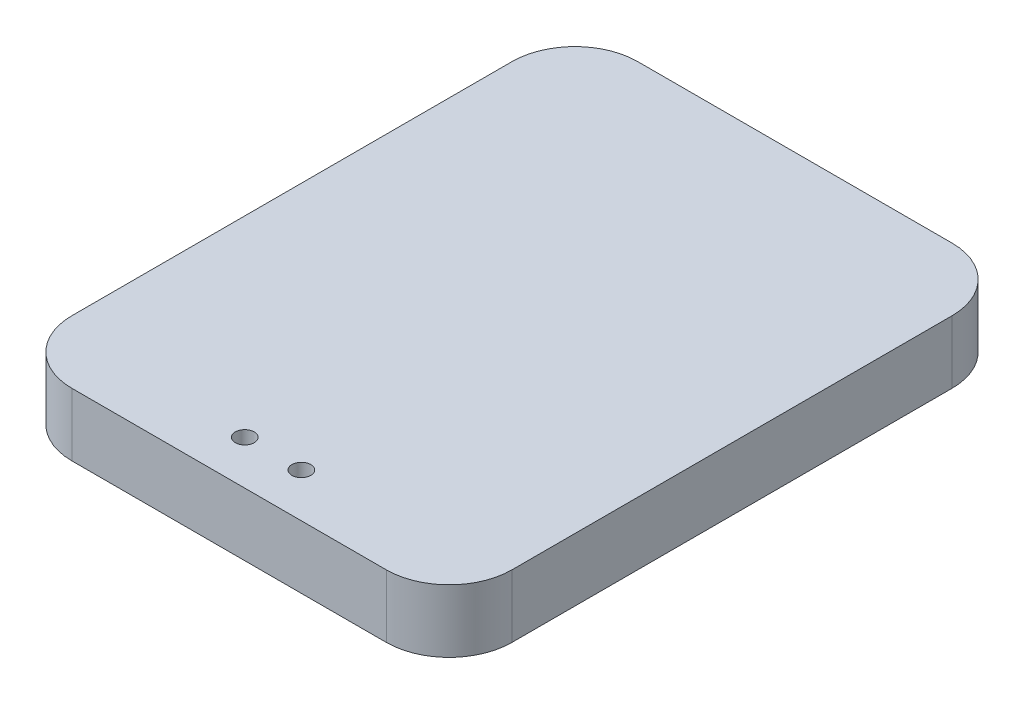
ISO-10303-21;
HEADER;
FILE_DESCRIPTION(('STEP AP214'),'2;1');
FILE_NAME('part.step','',(''),(''),'','','');
FILE_SCHEMA(('AUTOMOTIVE_DESIGN { 1 0 10303 214 1 1 1 1 }'));
ENDSEC;
DATA;
#1=APPLICATION_CONTEXT('core data for automotive mechanical design processes');
#2=APPLICATION_PROTOCOL_DEFINITION('international standard','automotive_design',2000,#1);
#3=PRODUCT_CONTEXT('',#1,'mechanical');
#4=PRODUCT('Part','Part','',(#3));
#5=PRODUCT_RELATED_PRODUCT_CATEGORY('part','',(#4));
#6=PRODUCT_DEFINITION_FORMATION('','',#4);
#7=PRODUCT_DEFINITION_CONTEXT('part definition',#1,'design');
#8=PRODUCT_DEFINITION('design','',#6,#7);
#9=PRODUCT_DEFINITION_SHAPE('','',#8);
#10=(LENGTH_UNIT() NAMED_UNIT(*) SI_UNIT(.MILLI.,.METRE.));
#11=(NAMED_UNIT(*) PLANE_ANGLE_UNIT() SI_UNIT($,.RADIAN.));
#12=(NAMED_UNIT(*) SI_UNIT($,.STERADIAN.) SOLID_ANGLE_UNIT());
#13=UNCERTAINTY_MEASURE_WITH_UNIT(LENGTH_MEASURE(1.E-05),#10,'distance_accuracy_value','');
#14=(GEOMETRIC_REPRESENTATION_CONTEXT(3) GLOBAL_UNCERTAINTY_ASSIGNED_CONTEXT((#13)) GLOBAL_UNIT_ASSIGNED_CONTEXT((#10,
#11,#12)) REPRESENTATION_CONTEXT('',''));
#15=CARTESIAN_POINT('',(0.,0.,0.));
#16=DIRECTION('',(0.,0.,1.));
#17=DIRECTION('',(1.,0.,0.));
#18=AXIS2_PLACEMENT_3D('',#15,#16,#17);
#19=CARTESIAN_POINT('',(-35.,5.,45.));
#20=DIRECTION('',(1.,0.,0.));
#21=DIRECTION('',(0.,0.,-1.));
#22=AXIS2_PLACEMENT_3D('',#19,#20,#21);
#23=PLANE('',#22);
#24=DIRECTION('',(0.,0.,1.));
#25=VECTOR('',#24,1.);
#26=CARTESIAN_POINT('',(-35.,5.,45.));
#27=LINE('',#26,#25);
#28=CARTESIAN_POINT('',(-35.,5.,-35.));
#29=VERTEX_POINT('',#28);
#30=CARTESIAN_POINT('',(-35.,5.,35.));
#31=VERTEX_POINT('',#30);
#32=EDGE_CURVE('E126',#29,#31,#27,.T.);
#33=ORIENTED_EDGE('',*,*,#32,.F.);
#34=DIRECTION('',(0.,-1.,0.));
#35=VECTOR('',#34,1.);
#36=CARTESIAN_POINT('',(-35.,5.,-35.));
#37=LINE('',#36,#35);
#38=CARTESIAN_POINT('',(-35.,-5.,-35.));
#39=VERTEX_POINT('',#38);
#40=EDGE_CURVE('E111',#29,#39,#37,.T.);
#41=ORIENTED_EDGE('',*,*,#40,.T.);
#42=DIRECTION('',(0.,0.,1.));
#43=VECTOR('',#42,1.);
#44=CARTESIAN_POINT('',(-35.,-5.,45.));
#45=LINE('',#44,#43);
#46=CARTESIAN_POINT('',(-35.,-5.,35.));
#47=VERTEX_POINT('',#46);
#48=EDGE_CURVE('E123',#39,#47,#45,.T.);
#49=ORIENTED_EDGE('',*,*,#48,.T.);
#50=DIRECTION('',(0.,-1.,0.));
#51=VECTOR('',#50,1.);
#52=CARTESIAN_POINT('',(-35.,5.,35.));
#53=LINE('',#52,#51);
#54=EDGE_CURVE('E128',#47,#31,#53,.F.);
#55=ORIENTED_EDGE('',*,*,#54,.T.);
#56=EDGE_LOOP('',(#33,#41,#49,#55));
#57=FACE_BOUND('',#56,.T.);
#58=ADVANCED_FACE('F41',(#57),#23,.F.);
#59=CARTESIAN_POINT('',(35.,5.,45.));
#60=DIRECTION('',(0.,0.,-1.));
#61=DIRECTION('',(-1.,0.,0.));
#62=AXIS2_PLACEMENT_3D('',#59,#60,#61);
#63=PLANE('',#62);
#64=DIRECTION('',(1.,0.,0.));
#65=VECTOR('',#64,1.);
#66=CARTESIAN_POINT('',(35.,-5.,45.));
#67=LINE('',#66,#65);
#68=CARTESIAN_POINT('',(-25.,-5.,45.));
#69=VERTEX_POINT('',#68);
#70=CARTESIAN_POINT('',(25.,-5.,45.));
#71=VERTEX_POINT('',#70);
#72=EDGE_CURVE('E132',#69,#71,#67,.T.);
#73=ORIENTED_EDGE('',*,*,#72,.T.);
#74=DIRECTION('',(0.,-1.,0.));
#75=VECTOR('',#74,1.);
#76=CARTESIAN_POINT('',(25.,5.,45.));
#77=LINE('',#76,#75);
#78=CARTESIAN_POINT('',(25.,5.,45.));
#79=VERTEX_POINT('',#78);
#80=EDGE_CURVE('E11',#71,#79,#77,.F.);
#81=ORIENTED_EDGE('',*,*,#80,.T.);
#82=DIRECTION('',(1.,0.,0.));
#83=VECTOR('',#82,1.);
#84=CARTESIAN_POINT('',(35.,5.,45.));
#85=LINE('',#84,#83);
#86=CARTESIAN_POINT('',(-25.,5.,45.));
#87=VERTEX_POINT('',#86);
#88=EDGE_CURVE('E172',#87,#79,#85,.T.);
#89=ORIENTED_EDGE('',*,*,#88,.F.);
#90=DIRECTION('',(0.,-1.,0.));
#91=VECTOR('',#90,1.);
#92=CARTESIAN_POINT('',(-25.,5.,45.));
#93=LINE('',#92,#91);
#94=EDGE_CURVE('E49',#87,#69,#93,.T.);
#95=ORIENTED_EDGE('',*,*,#94,.T.);
#96=EDGE_LOOP('',(#73,#81,#89,#95));
#97=FACE_BOUND('',#96,.T.);
#98=ADVANCED_FACE('F170',(#97),#63,.F.);
#99=CARTESIAN_POINT('',(35.,5.,45.));
#100=DIRECTION('',(-1.,0.,0.));
#101=DIRECTION('',(0.,0.,1.));
#102=AXIS2_PLACEMENT_3D('',#99,#100,#101);
#103=PLANE('',#102);
#104=DIRECTION('',(0.,0.,-1.));
#105=VECTOR('',#104,1.);
#106=CARTESIAN_POINT('',(35.,-5.,45.));
#107=LINE('',#106,#105);
#108=CARTESIAN_POINT('',(35.,-5.,35.));
#109=VERTEX_POINT('',#108);
#110=CARTESIAN_POINT('',(35.,-5.,-35.));
#111=VERTEX_POINT('',#110);
#112=EDGE_CURVE('E136',#109,#111,#107,.T.);
#113=ORIENTED_EDGE('',*,*,#112,.T.);
#114=DIRECTION('',(0.,-1.,0.));
#115=VECTOR('',#114,1.);
#116=CARTESIAN_POINT('',(35.,5.,-35.));
#117=LINE('',#116,#115);
#118=CARTESIAN_POINT('',(35.,5.,-35.));
#119=VERTEX_POINT('',#118);
#120=EDGE_CURVE('E56',#111,#119,#117,.F.);
#121=ORIENTED_EDGE('',*,*,#120,.T.);
#122=DIRECTION('',(0.,0.,-1.));
#123=VECTOR('',#122,1.);
#124=CARTESIAN_POINT('',(35.,5.,45.));
#125=LINE('',#124,#123);
#126=CARTESIAN_POINT('',(35.,5.,35.));
#127=VERTEX_POINT('',#126);
#128=EDGE_CURVE('E180',#127,#119,#125,.T.);
#129=ORIENTED_EDGE('',*,*,#128,.F.);
#130=DIRECTION('',(0.,-1.,0.));
#131=VECTOR('',#130,1.);
#132=CARTESIAN_POINT('',(35.,5.,35.));
#133=LINE('',#132,#131);
#134=EDGE_CURVE('E163',#127,#109,#133,.T.);
#135=ORIENTED_EDGE('',*,*,#134,.T.);
#136=EDGE_LOOP('',(#113,#121,#129,#135));
#137=FACE_BOUND('',#136,.T.);
#138=ADVANCED_FACE('F179',(#137),#103,.F.);
#139=CARTESIAN_POINT('',(35.,5.,-45.));
#140=DIRECTION('',(0.,0.,1.));
#141=DIRECTION('',(1.,0.,0.));
#142=AXIS2_PLACEMENT_3D('',#139,#140,#141);
#143=PLANE('',#142);
#144=DIRECTION('',(-1.,0.,0.));
#145=VECTOR('',#144,1.);
#146=CARTESIAN_POINT('',(35.,-5.,-45.));
#147=LINE('',#146,#145);
#148=CARTESIAN_POINT('',(25.,-5.,-45.));
#149=VERTEX_POINT('',#148);
#150=CARTESIAN_POINT('',(-25.,-5.,-45.));
#151=VERTEX_POINT('',#150);
#152=EDGE_CURVE('E146',#149,#151,#147,.T.);
#153=ORIENTED_EDGE('',*,*,#152,.T.);
#154=DIRECTION('',(0.,-1.,0.));
#155=VECTOR('',#154,1.);
#156=CARTESIAN_POINT('',(-25.,5.,-45.));
#157=LINE('',#156,#155);
#158=CARTESIAN_POINT('',(-25.,5.,-45.));
#159=VERTEX_POINT('',#158);
#160=EDGE_CURVE('E112',#151,#159,#157,.F.);
#161=ORIENTED_EDGE('',*,*,#160,.T.);
#162=DIRECTION('',(-1.,0.,0.));
#163=VECTOR('',#162,1.);
#164=CARTESIAN_POINT('',(35.,5.,-45.));
#165=LINE('',#164,#163);
#166=CARTESIAN_POINT('',(25.,5.,-45.));
#167=VERTEX_POINT('',#166);
#168=EDGE_CURVE('E142',#167,#159,#165,.T.);
#169=ORIENTED_EDGE('',*,*,#168,.F.);
#170=DIRECTION('',(0.,-1.,0.));
#171=VECTOR('',#170,1.);
#172=CARTESIAN_POINT('',(25.,5.,-45.));
#173=LINE('',#172,#171);
#174=EDGE_CURVE('E117',#167,#149,#173,.T.);
#175=ORIENTED_EDGE('',*,*,#174,.T.);
#176=EDGE_LOOP('',(#153,#161,#169,#175));
#177=FACE_BOUND('',#176,.T.);
#178=ADVANCED_FACE('F200',(#177),#143,.F.);
#179=CARTESIAN_POINT('',(0.,5.,0.));
#180=DIRECTION('',(0.,1.,0.));
#181=DIRECTION('',(0.,0.,1.));
#182=AXIS2_PLACEMENT_3D('',#179,#180,#181);
#183=PLANE('',#182);
#184=CARTESIAN_POINT('',(-4.50000000000001,5.,38.));
#185=DIRECTION('',(0.,1.,0.));
#186=DIRECTION('',(0.,0.,1.));
#187=AXIS2_PLACEMENT_3D('',#184,#185,#186);
#188=CIRCLE('',#187,1.5);
#189=CARTESIAN_POINT('',(-4.50000000000001,5.,39.5));
#190=VERTEX_POINT('',#189);
#191=EDGE_CURVE('E139',#190,#190,#188,.T.);
#192=ORIENTED_EDGE('',*,*,#191,.F.);
#193=EDGE_LOOP('',(#192));
#194=FACE_BOUND('',#193,.T.);
#195=CARTESIAN_POINT('',(4.5,5.,38.));
#196=DIRECTION('',(0.,1.,0.));
#197=DIRECTION('',(0.,0.,1.));
#198=AXIS2_PLACEMENT_3D('',#195,#196,#197);
#199=CIRCLE('',#198,1.5);
#200=CARTESIAN_POINT('',(4.5,5.,39.5));
#201=VERTEX_POINT('',#200);
#202=EDGE_CURVE('E189',#201,#201,#199,.T.);
#203=ORIENTED_EDGE('',*,*,#202,.F.);
#204=EDGE_LOOP('',(#203));
#205=FACE_BOUND('',#204,.T.);
#206=ORIENTED_EDGE('',*,*,#168,.T.);
#207=CARTESIAN_POINT('',(-25.,5.,-35.));
#208=DIRECTION('',(0.,1.,0.));
#209=DIRECTION('',(0.,0.,1.));
#210=AXIS2_PLACEMENT_3D('',#207,#208,#209);
#211=CIRCLE('',#210,10.);
#212=EDGE_CURVE('E161',#159,#29,#211,.T.);
#213=ORIENTED_EDGE('',*,*,#212,.T.);
#214=ORIENTED_EDGE('',*,*,#32,.T.);
#215=CARTESIAN_POINT('',(-25.,5.,35.));
#216=DIRECTION('',(0.,1.,0.));
#217=DIRECTION('',(0.,0.,1.));
#218=AXIS2_PLACEMENT_3D('',#215,#216,#217);
#219=CIRCLE('',#218,10.);
#220=EDGE_CURVE('E156',#31,#87,#219,.T.);
#221=ORIENTED_EDGE('',*,*,#220,.T.);
#222=ORIENTED_EDGE('',*,*,#88,.T.);
#223=CARTESIAN_POINT('',(25.,5.,35.));
#224=DIRECTION('',(0.,1.,0.));
#225=DIRECTION('',(0.,0.,1.));
#226=AXIS2_PLACEMENT_3D('',#223,#224,#225);
#227=CIRCLE('',#226,10.);
#228=EDGE_CURVE('E63',#79,#127,#227,.T.);
#229=ORIENTED_EDGE('',*,*,#228,.T.);
#230=ORIENTED_EDGE('',*,*,#128,.T.);
#231=CARTESIAN_POINT('',(25.,5.,-35.));
#232=DIRECTION('',(0.,1.,0.));
#233=DIRECTION('',(0.,0.,1.));
#234=AXIS2_PLACEMENT_3D('',#231,#232,#233);
#235=CIRCLE('',#234,10.);
#236=EDGE_CURVE('E159',#119,#167,#235,.T.);
#237=ORIENTED_EDGE('',*,*,#236,.T.);
#238=EDGE_LOOP('',(#206,#213,#214,#221,#222,#229,#230,#237));
#239=FACE_BOUND('',#238,.T.);
#240=ADVANCED_FACE('F197',(#194,#205,#239),#183,.T.);
#241=CARTESIAN_POINT('',(0.,-5.,0.));
#242=DIRECTION('',(0.,1.,0.));
#243=DIRECTION('',(0.,0.,1.));
#244=AXIS2_PLACEMENT_3D('',#241,#242,#243);
#245=PLANE('',#244);
#246=CARTESIAN_POINT('',(-4.50000000000001,-5.,38.));
#247=DIRECTION('',(0.,1.,0.));
#248=DIRECTION('',(0.,0.,1.));
#249=AXIS2_PLACEMENT_3D('',#246,#247,#248);
#250=CIRCLE('',#249,1.5);
#251=CARTESIAN_POINT('',(-4.50000000000001,-5.,39.5));
#252=VERTEX_POINT('',#251);
#253=EDGE_CURVE('E133',#252,#252,#250,.T.);
#254=ORIENTED_EDGE('',*,*,#253,.T.);
#255=EDGE_LOOP('',(#254));
#256=FACE_BOUND('',#255,.T.);
#257=CARTESIAN_POINT('',(4.5,-5.,38.));
#258=DIRECTION('',(0.,1.,0.));
#259=DIRECTION('',(0.,0.,1.));
#260=AXIS2_PLACEMENT_3D('',#257,#258,#259);
#261=CIRCLE('',#260,1.5);
#262=CARTESIAN_POINT('',(4.5,-5.,39.5));
#263=VERTEX_POINT('',#262);
#264=EDGE_CURVE('E186',#263,#263,#261,.T.);
#265=ORIENTED_EDGE('',*,*,#264,.T.);
#266=EDGE_LOOP('',(#265));
#267=FACE_BOUND('',#266,.T.);
#268=ORIENTED_EDGE('',*,*,#48,.F.);
#269=CARTESIAN_POINT('',(-25.,-5.,-35.));
#270=DIRECTION('',(0.,1.,0.));
#271=DIRECTION('',(0.,0.,1.));
#272=AXIS2_PLACEMENT_3D('',#269,#270,#271);
#273=CIRCLE('',#272,10.);
#274=EDGE_CURVE('E107',#39,#151,#273,.F.);
#275=ORIENTED_EDGE('',*,*,#274,.T.);
#276=ORIENTED_EDGE('',*,*,#152,.F.);
#277=CARTESIAN_POINT('',(25.,-5.,-35.));
#278=DIRECTION('',(0.,1.,0.));
#279=DIRECTION('',(0.,0.,1.));
#280=AXIS2_PLACEMENT_3D('',#277,#278,#279);
#281=CIRCLE('',#280,10.);
#282=EDGE_CURVE('E118',#149,#111,#281,.F.);
#283=ORIENTED_EDGE('',*,*,#282,.T.);
#284=ORIENTED_EDGE('',*,*,#112,.F.);
#285=CARTESIAN_POINT('',(25.,-5.,35.));
#286=DIRECTION('',(0.,1.,0.));
#287=DIRECTION('',(0.,0.,1.));
#288=AXIS2_PLACEMENT_3D('',#285,#286,#287);
#289=CIRCLE('',#288,10.);
#290=EDGE_CURVE('E150',#109,#71,#289,.F.);
#291=ORIENTED_EDGE('',*,*,#290,.T.);
#292=ORIENTED_EDGE('',*,*,#72,.F.);
#293=CARTESIAN_POINT('',(-25.,-5.,35.));
#294=DIRECTION('',(0.,1.,0.));
#295=DIRECTION('',(0.,0.,1.));
#296=AXIS2_PLACEMENT_3D('',#293,#294,#295);
#297=CIRCLE('',#296,10.);
#298=EDGE_CURVE('E127',#69,#47,#297,.F.);
#299=ORIENTED_EDGE('',*,*,#298,.T.);
#300=EDGE_LOOP('',(#268,#275,#276,#283,#284,#291,#292,#299));
#301=FACE_BOUND('',#300,.T.);
#302=ADVANCED_FACE('F130',(#256,#267,#301),#245,.F.);
#303=CARTESIAN_POINT('',(-25.,5.,-35.));
#304=DIRECTION('',(0.,-1.,0.));
#305=DIRECTION('',(0.,0.,-1.));
#306=AXIS2_PLACEMENT_3D('',#303,#304,#305);
#307=CYLINDRICAL_SURFACE('',#306,10.);
#308=ORIENTED_EDGE('',*,*,#212,.F.);
#309=ORIENTED_EDGE('',*,*,#160,.F.);
#310=ORIENTED_EDGE('',*,*,#274,.F.);
#311=ORIENTED_EDGE('',*,*,#40,.F.);
#312=EDGE_LOOP('',(#308,#309,#310,#311));
#313=FACE_BOUND('',#312,.T.);
#314=ADVANCED_FACE('F110',(#313),#307,.T.);
#315=CARTESIAN_POINT('',(25.,5.,-35.));
#316=DIRECTION('',(0.,-1.,0.));
#317=DIRECTION('',(0.,0.,-1.));
#318=AXIS2_PLACEMENT_3D('',#315,#316,#317);
#319=CYLINDRICAL_SURFACE('',#318,10.);
#320=ORIENTED_EDGE('',*,*,#236,.F.);
#321=ORIENTED_EDGE('',*,*,#120,.F.);
#322=ORIENTED_EDGE('',*,*,#282,.F.);
#323=ORIENTED_EDGE('',*,*,#174,.F.);
#324=EDGE_LOOP('',(#320,#321,#322,#323));
#325=FACE_BOUND('',#324,.T.);
#326=ADVANCED_FACE('F207',(#325),#319,.T.);
#327=CARTESIAN_POINT('',(25.,5.,35.));
#328=DIRECTION('',(0.,-1.,0.));
#329=DIRECTION('',(0.,0.,-1.));
#330=AXIS2_PLACEMENT_3D('',#327,#328,#329);
#331=CYLINDRICAL_SURFACE('',#330,10.);
#332=ORIENTED_EDGE('',*,*,#228,.F.);
#333=ORIENTED_EDGE('',*,*,#80,.F.);
#334=ORIENTED_EDGE('',*,*,#290,.F.);
#335=ORIENTED_EDGE('',*,*,#134,.F.);
#336=EDGE_LOOP('',(#332,#333,#334,#335));
#337=FACE_BOUND('',#336,.T.);
#338=ADVANCED_FACE('F178',(#337),#331,.T.);
#339=CARTESIAN_POINT('',(-25.,5.,35.));
#340=DIRECTION('',(0.,-1.,0.));
#341=DIRECTION('',(0.,0.,-1.));
#342=AXIS2_PLACEMENT_3D('',#339,#340,#341);
#343=CYLINDRICAL_SURFACE('',#342,10.);
#344=ORIENTED_EDGE('',*,*,#220,.F.);
#345=ORIENTED_EDGE('',*,*,#54,.F.);
#346=ORIENTED_EDGE('',*,*,#298,.F.);
#347=ORIENTED_EDGE('',*,*,#94,.F.);
#348=EDGE_LOOP('',(#344,#345,#346,#347));
#349=FACE_BOUND('',#348,.T.);
#350=ADVANCED_FACE('F43',(#349),#343,.T.);
#351=CARTESIAN_POINT('',(4.5,-5.,38.));
#352=DIRECTION('',(0.,1.,0.));
#353=DIRECTION('',(0.,0.,1.));
#354=AXIS2_PLACEMENT_3D('',#351,#352,#353);
#355=CYLINDRICAL_SURFACE('',#354,1.5);
#356=ORIENTED_EDGE('',*,*,#264,.F.);
#357=EDGE_LOOP('',(#356));
#358=FACE_BOUND('',#357,.T.);
#359=ORIENTED_EDGE('',*,*,#202,.T.);
#360=EDGE_LOOP('',(#359));
#361=FACE_BOUND('',#360,.T.);
#362=ADVANCED_FACE('F229',(#358,#361),#355,.F.);
#363=CARTESIAN_POINT('',(-4.50000000000001,-5.,38.));
#364=DIRECTION('',(0.,1.,0.));
#365=DIRECTION('',(0.,0.,1.));
#366=AXIS2_PLACEMENT_3D('',#363,#364,#365);
#367=CYLINDRICAL_SURFACE('',#366,1.5);
#368=ORIENTED_EDGE('',*,*,#253,.F.);
#369=EDGE_LOOP('',(#368));
#370=FACE_BOUND('',#369,.T.);
#371=ORIENTED_EDGE('',*,*,#191,.T.);
#372=EDGE_LOOP('',(#371));
#373=FACE_BOUND('',#372,.T.);
#374=ADVANCED_FACE('F195',(#370,#373),#367,.F.);
#375=CLOSED_SHELL('',(#58,#98,#138,#178,#240,#302,#314,#326,#338,#350,#362,#374));
#376=MANIFOLD_SOLID_BREP('B2',#375);
#377=ADVANCED_BREP_SHAPE_REPRESENTATION('',(#18,#376),#14);
#378=SHAPE_DEFINITION_REPRESENTATION(#9,#377);
ENDSEC;
END-ISO-10303-21;
